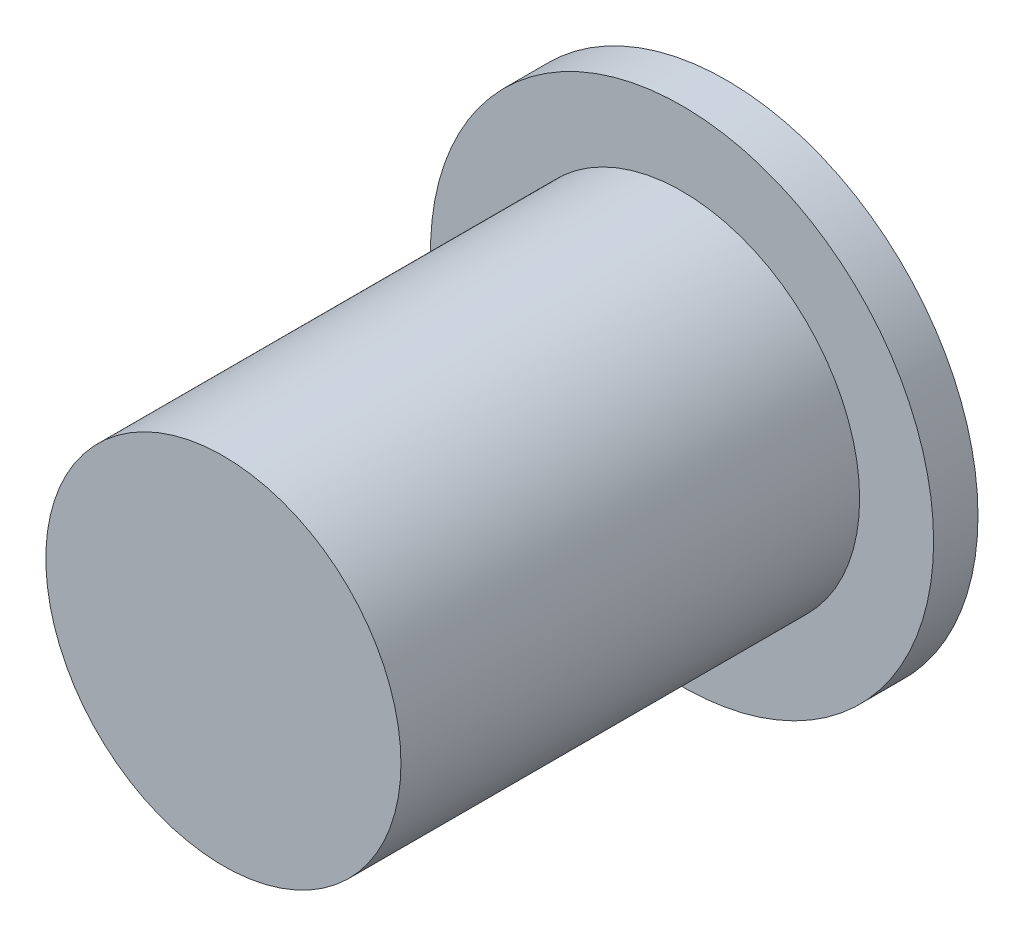
ISO-10303-21;
HEADER;
FILE_DESCRIPTION(('STEP AP214'),'2;1');
FILE_NAME('part.step','',(''),(''),'','','');
FILE_SCHEMA(('AUTOMOTIVE_DESIGN { 1 0 10303 214 1 1 1 1 }'));
ENDSEC;
DATA;
#1=APPLICATION_CONTEXT('core data for automotive mechanical design processes');
#2=APPLICATION_PROTOCOL_DEFINITION('international standard','automotive_design',2000,#1);
#3=PRODUCT_CONTEXT('',#1,'mechanical');
#4=PRODUCT('Part','Part','',(#3));
#5=PRODUCT_RELATED_PRODUCT_CATEGORY('part','',(#4));
#6=PRODUCT_DEFINITION_FORMATION('','',#4);
#7=PRODUCT_DEFINITION_CONTEXT('part definition',#1,'design');
#8=PRODUCT_DEFINITION('design','',#6,#7);
#9=PRODUCT_DEFINITION_SHAPE('','',#8);
#10=(LENGTH_UNIT() NAMED_UNIT(*) SI_UNIT(.MILLI.,.METRE.));
#11=(NAMED_UNIT(*) PLANE_ANGLE_UNIT() SI_UNIT($,.RADIAN.));
#12=(NAMED_UNIT(*) SI_UNIT($,.STERADIAN.) SOLID_ANGLE_UNIT());
#13=UNCERTAINTY_MEASURE_WITH_UNIT(LENGTH_MEASURE(1.E-05),#10,'distance_accuracy_value','');
#14=(GEOMETRIC_REPRESENTATION_CONTEXT(3) GLOBAL_UNCERTAINTY_ASSIGNED_CONTEXT((#13)) GLOBAL_UNIT_ASSIGNED_CONTEXT((#10,
#11,#12)) REPRESENTATION_CONTEXT('',''));
#15=CARTESIAN_POINT('',(0.,0.,0.));
#16=DIRECTION('',(0.,0.,1.));
#17=DIRECTION('',(1.,0.,0.));
#18=AXIS2_PLACEMENT_3D('',#15,#16,#17);
#19=CARTESIAN_POINT('',(12.,0.,0.));
#20=DIRECTION('',(0.,0.,1.));
#21=DIRECTION('',(1.,0.,0.));
#22=AXIS2_PLACEMENT_3D('',#19,#20,#21);
#23=PLANE('',#22);
#24=CARTESIAN_POINT('',(0.,0.,0.));
#25=DIRECTION('',(0.,0.,1.));
#26=DIRECTION('',(1.,0.,0.));
#27=AXIS2_PLACEMENT_3D('',#24,#25,#26);
#28=CIRCLE('',#27,12.);
#29=CARTESIAN_POINT('',(12.,0.,0.));
#30=VERTEX_POINT('',#29);
#31=EDGE_CURVE('E54',#30,#30,#28,.T.);
#32=ORIENTED_EDGE('',*,*,#31,.T.);
#33=EDGE_LOOP('',(#32));
#34=FACE_BOUND('',#33,.T.);
#35=ADVANCED_FACE('F37',(#34),#23,.T.);
#36=CARTESIAN_POINT('',(0.,0.,-34.));
#37=DIRECTION('',(0.,0.,-1.));
#38=DIRECTION('',(-1.,0.,0.));
#39=AXIS2_PLACEMENT_3D('',#36,#37,#38);
#40=PLANE('',#39);
#41=CARTESIAN_POINT('',(0.,0.,-34.));
#42=DIRECTION('',(0.,0.,1.));
#43=DIRECTION('',(1.,0.,0.));
#44=AXIS2_PLACEMENT_3D('',#41,#42,#43);
#45=CIRCLE('',#44,17.);
#46=CARTESIAN_POINT('',(17.,0.,-34.));
#47=VERTEX_POINT('',#46);
#48=EDGE_CURVE('E10',#47,#47,#45,.T.);
#49=ORIENTED_EDGE('',*,*,#48,.F.);
#50=EDGE_LOOP('',(#49));
#51=FACE_BOUND('',#50,.T.);
#52=ADVANCED_FACE('F73',(#51),#40,.T.);
#53=CARTESIAN_POINT('',(0.,0.,0.));
#54=DIRECTION('',(0.,0.,1.));
#55=DIRECTION('',(1.,0.,0.));
#56=AXIS2_PLACEMENT_3D('',#53,#54,#55);
#57=CYLINDRICAL_SURFACE('',#56,17.);
#58=ORIENTED_EDGE('',*,*,#48,.T.);
#59=EDGE_LOOP('',(#58));
#60=FACE_BOUND('',#59,.T.);
#61=CARTESIAN_POINT('',(0.,0.,-31.));
#62=DIRECTION('',(0.,0.,1.));
#63=DIRECTION('',(1.,0.,0.));
#64=AXIS2_PLACEMENT_3D('',#61,#62,#63);
#65=CIRCLE('',#64,17.);
#66=CARTESIAN_POINT('',(17.,0.,-31.));
#67=VERTEX_POINT('',#66);
#68=EDGE_CURVE('E44',#67,#67,#65,.T.);
#69=ORIENTED_EDGE('',*,*,#68,.F.);
#70=EDGE_LOOP('',(#69));
#71=FACE_BOUND('',#70,.T.);
#72=ADVANCED_FACE('F70',(#60,#71),#57,.T.);
#73=CARTESIAN_POINT('',(17.,0.,-31.));
#74=DIRECTION('',(0.,0.,1.));
#75=DIRECTION('',(1.,0.,0.));
#76=AXIS2_PLACEMENT_3D('',#73,#74,#75);
#77=PLANE('',#76);
#78=ORIENTED_EDGE('',*,*,#68,.T.);
#79=EDGE_LOOP('',(#78));
#80=FACE_BOUND('',#79,.T.);
#81=CARTESIAN_POINT('',(0.,0.,-31.));
#82=DIRECTION('',(0.,0.,1.));
#83=DIRECTION('',(1.,0.,0.));
#84=AXIS2_PLACEMENT_3D('',#81,#82,#83);
#85=CIRCLE('',#84,12.);
#86=CARTESIAN_POINT('',(12.,0.,-31.));
#87=VERTEX_POINT('',#86);
#88=EDGE_CURVE('E49',#87,#87,#85,.T.);
#89=ORIENTED_EDGE('',*,*,#88,.F.);
#90=EDGE_LOOP('',(#89));
#91=FACE_BOUND('',#90,.T.);
#92=ADVANCED_FACE('F64',(#80,#91),#77,.T.);
#93=CARTESIAN_POINT('',(0.,0.,0.));
#94=DIRECTION('',(0.,0.,1.));
#95=DIRECTION('',(1.,0.,0.));
#96=AXIS2_PLACEMENT_3D('',#93,#94,#95);
#97=CYLINDRICAL_SURFACE('',#96,12.);
#98=ORIENTED_EDGE('',*,*,#88,.T.);
#99=EDGE_LOOP('',(#98));
#100=FACE_BOUND('',#99,.T.);
#101=ORIENTED_EDGE('',*,*,#31,.F.);
#102=EDGE_LOOP('',(#101));
#103=FACE_BOUND('',#102,.T.);
#104=ADVANCED_FACE('F62',(#100,#103),#97,.T.);
#105=CLOSED_SHELL('',(#35,#52,#72,#92,#104));
#106=MANIFOLD_SOLID_BREP('B2',#105);
#107=ADVANCED_BREP_SHAPE_REPRESENTATION('',(#18,#106),#14);
#108=SHAPE_DEFINITION_REPRESENTATION(#9,#107);
ENDSEC;
END-ISO-10303-21;
